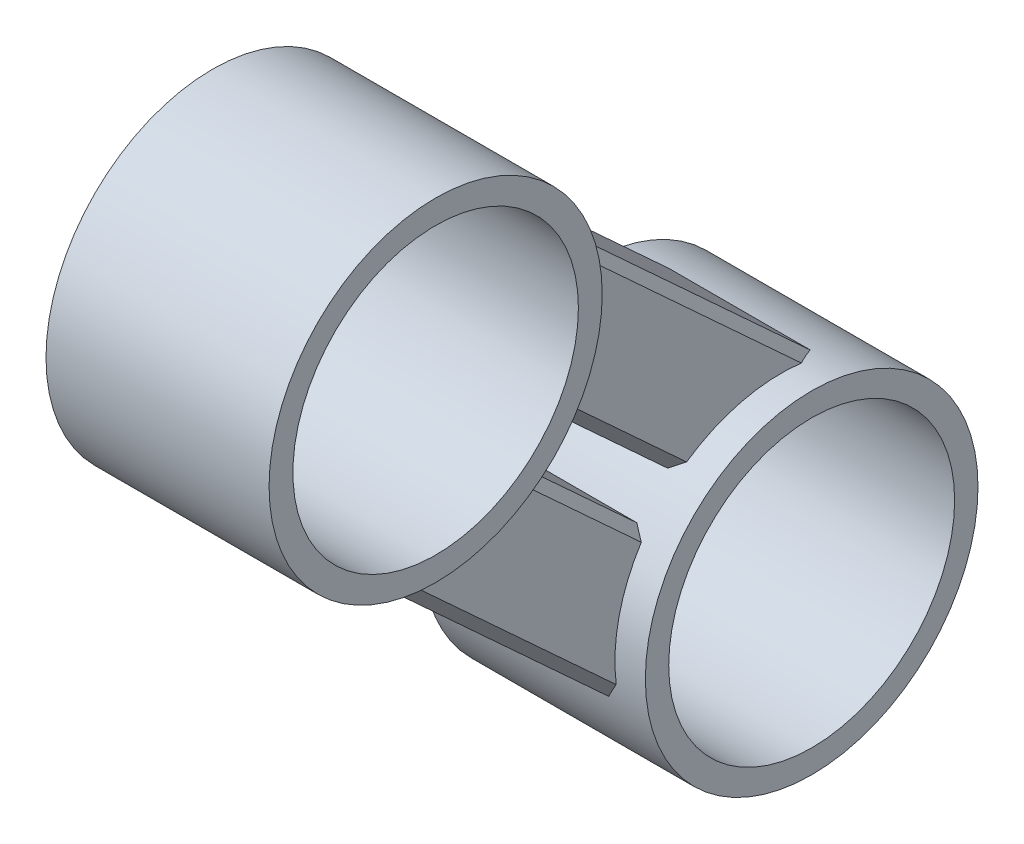
ISO-10303-21;
HEADER;
FILE_DESCRIPTION(('STEP AP214'),'2;1');
FILE_NAME('part.step','',(''),(''),'','','');
FILE_SCHEMA(('AUTOMOTIVE_DESIGN { 1 0 10303 214 1 1 1 1 }'));
ENDSEC;
DATA;
#1=APPLICATION_CONTEXT('core data for automotive mechanical design processes');
#2=APPLICATION_PROTOCOL_DEFINITION('international standard','automotive_design',2000,#1);
#3=PRODUCT_CONTEXT('',#1,'mechanical');
#4=PRODUCT('Part','Part','',(#3));
#5=PRODUCT_RELATED_PRODUCT_CATEGORY('part','',(#4));
#6=PRODUCT_DEFINITION_FORMATION('','',#4);
#7=PRODUCT_DEFINITION_CONTEXT('part definition',#1,'design');
#8=PRODUCT_DEFINITION('design','',#6,#7);
#9=PRODUCT_DEFINITION_SHAPE('','',#8);
#10=(LENGTH_UNIT() NAMED_UNIT(*) SI_UNIT(.MILLI.,.METRE.));
#11=(NAMED_UNIT(*) PLANE_ANGLE_UNIT() SI_UNIT($,.RADIAN.));
#12=(NAMED_UNIT(*) SI_UNIT($,.STERADIAN.) SOLID_ANGLE_UNIT());
#13=UNCERTAINTY_MEASURE_WITH_UNIT(LENGTH_MEASURE(1.E-05),#10,'distance_accuracy_value','');
#14=(GEOMETRIC_REPRESENTATION_CONTEXT(3) GLOBAL_UNCERTAINTY_ASSIGNED_CONTEXT((#13)) GLOBAL_UNIT_ASSIGNED_CONTEXT((#10,
#11,#12)) REPRESENTATION_CONTEXT('',''));
#15=CARTESIAN_POINT('',(0.,0.,0.));
#16=DIRECTION('',(0.,0.,1.));
#17=DIRECTION('',(1.,0.,0.));
#18=AXIS2_PLACEMENT_3D('',#15,#16,#17);
#19=CARTESIAN_POINT('',(-14.713204,0.,0.));
#20=DIRECTION('',(1.,0.,0.));
#21=DIRECTION('',(0.,0.,-1.));
#22=AXIS2_PLACEMENT_3D('',#19,#20,#21);
#23=PLANE('',#22);
#24=CARTESIAN_POINT('',(-14.713204,438.166256,-86.798404));
#25=DIRECTION('',(1.,0.,0.));
#26=DIRECTION('',(0.,0.,-1.));
#27=AXIS2_PLACEMENT_3D('',#24,#25,#26);
#28=CIRCLE('',#27,30.1777538629966);
#29=CARTESIAN_POINT('',(-14.713204,454.478959614716,-61.4095771465586));
#30=VERTEX_POINT('',#29);
#31=CARTESIAN_POINT('',(-14.713204,434.38874318098,-56.8580094615551));
#32=VERTEX_POINT('',#31);
#33=EDGE_CURVE('E164',#30,#32,#28,.T.);
#34=ORIENTED_EDGE('',*,*,#33,.T.);
#35=DIRECTION('',(0.,0.676780174351595,0.736185163939497));
#36=VECTOR('',#35,1.);
#37=CARTESIAN_POINT('',(-14.713204,263.753737203528,-242.470656832143));
#38=LINE('',#37,#36);
#39=CARTESIAN_POINT('',(-14.713204,472.481941944729,-15.4211458540503));
#40=VERTEX_POINT('',#39);
#41=EDGE_CURVE('E149',#32,#40,#38,.T.);
#42=ORIENTED_EDGE('',*,*,#41,.T.);
#43=CARTESIAN_POINT('',(-14.713204,502.541794,-18.569432));
#44=DIRECTION('',(1.,0.,0.));
#45=DIRECTION('',(0.,0.,-1.));
#46=AXIS2_PLACEMENT_3D('',#43,#44,#45);
#47=CIRCLE('',#46,30.2242685807545);
#48=CARTESIAN_POINT('',(-14.713204,477.844848812442,-35.9926151088452));
#49=VERTEX_POINT('',#48);
#50=EDGE_CURVE('E161',#40,#49,#47,.T.);
#51=ORIENTED_EDGE('',*,*,#50,.T.);
#52=DIRECTION('',(0.,-0.676778574479396,-0.736186634710001));
#53=VECTOR('',#52,1.);
#54=CARTESIAN_POINT('',(-14.713204,276.910729279913,-254.564861387267));
#55=LINE('',#54,#53);
#56=EDGE_CURVE('E166',#49,#30,#55,.T.);
#57=ORIENTED_EDGE('',*,*,#56,.T.);
#58=EDGE_LOOP('',(#34,#42,#51,#57));
#59=FACE_BOUND('',#58,.T.);
#60=ADVANCED_FACE('F33',(#59),#23,.F.);
#61=CARTESIAN_POINT('',(14.713204,0.,0.));
#62=DIRECTION('',(1.,0.,0.));
#63=DIRECTION('',(0.,0.,-1.));
#64=AXIS2_PLACEMENT_3D('',#61,#62,#63);
#65=PLANE('',#64);
#66=CARTESIAN_POINT('',(14.713204,502.541794,-18.569432));
#67=DIRECTION('',(1.,0.,0.));
#68=DIRECTION('',(0.,0.,-1.));
#69=AXIS2_PLACEMENT_3D('',#66,#67,#68);
#70=CIRCLE('',#69,30.2242685807545);
#71=CARTESIAN_POINT('',(14.713204,472.481941944729,-15.4211458540503));
#72=VERTEX_POINT('',#71);
#73=CARTESIAN_POINT('',(14.713204,477.844848812442,-35.9926151088453));
#74=VERTEX_POINT('',#73);
#75=EDGE_CURVE('E217',#72,#74,#70,.T.);
#76=ORIENTED_EDGE('',*,*,#75,.F.);
#77=DIRECTION('',(0.,-0.676780174351595,-0.736185163939497));
#78=VECTOR('',#77,1.);
#79=CARTESIAN_POINT('',(14.713204,432.702139805708,-58.6926559677333));
#80=LINE('',#79,#78);
#81=CARTESIAN_POINT('',(14.713204,434.38874318098,-56.8580094615551));
#82=VERTEX_POINT('',#81);
#83=EDGE_CURVE('E245',#72,#82,#80,.T.);
#84=ORIENTED_EDGE('',*,*,#83,.T.);
#85=CARTESIAN_POINT('',(14.713204,438.166256,-86.798404));
#86=DIRECTION('',(1.,0.,0.));
#87=DIRECTION('',(0.,0.,-1.));
#88=AXIS2_PLACEMENT_3D('',#85,#86,#87);
#89=CIRCLE('',#88,30.1777538629966);
#90=CARTESIAN_POINT('',(14.713204,454.478959614716,-61.4095771465587));
#91=VERTEX_POINT('',#90);
#92=EDGE_CURVE('E193',#91,#82,#89,.T.);
#93=ORIENTED_EDGE('',*,*,#92,.F.);
#94=DIRECTION('',(0.,0.676778574479396,0.736186634710001));
#95=VECTOR('',#94,1.);
#96=CARTESIAN_POINT('',(14.713204,477.609993653024,-36.248086005792));
#97=LINE('',#96,#95);
#98=EDGE_CURVE('E243',#91,#74,#97,.T.);
#99=ORIENTED_EDGE('',*,*,#98,.T.);
#100=EDGE_LOOP('',(#76,#84,#93,#99));
#101=FACE_BOUND('',#100,.T.);
#102=ADVANCED_FACE('F319',(#101),#65,.T.);
#103=CARTESIAN_POINT('',(-14.713204,438.166256,-86.798404));
#104=DIRECTION('',(1.,0.,0.));
#105=DIRECTION('',(0.,0.,-1.));
#106=AXIS2_PLACEMENT_3D('',#103,#104,#105);
#107=CYLINDRICAL_SURFACE('',#106,30.1777538629966);
#108=ORIENTED_EDGE('',*,*,#33,.F.);
#109=CARTESIAN_POINT('',(-9.53978433156355,438.166256,-86.798404));
#110=DIRECTION('',(0.707106781186558,-0.520562561622338,0.478554719376139));
#111=DIRECTION('',(0.707106781186537,0.520562561622353,-0.478554719376153));
#112=AXIS2_PLACEMENT_3D('',#109,#110,#111);
#113=ELLIPSE('',#112,42.6777887950062,30.1777538629966);
#114=CARTESIAN_POINT('',(-12.8186179999999,456.055171480117,-62.4944222035779));
#115=VERTEX_POINT('',#114);
#116=EDGE_CURVE('E251',#30,#115,#113,.F.);
#117=ORIENTED_EDGE('',*,*,#116,.T.);
#118=DIRECTION('',(1.,0.,0.));
#119=VECTOR('',#118,1.);
#120=CARTESIAN_POINT('',(-14.713204,456.055171480117,-62.4944222035779));
#121=LINE('',#120,#119);
#122=CARTESIAN_POINT('',(12.8186179999999,456.055171480117,-62.4944222035779));
#123=VERTEX_POINT('',#122);
#124=EDGE_CURVE('E207',#115,#123,#121,.T.);
#125=ORIENTED_EDGE('',*,*,#124,.T.);
#126=CARTESIAN_POINT('',(9.53978433156348,438.166256,-86.798404));
#127=DIRECTION('',(0.707106781186547,0.520562561622346,-0.478554719376146));
#128=DIRECTION('',(0.707106781186548,-0.520562561622345,0.478554719376145));
#129=AXIS2_PLACEMENT_3D('',#126,#127,#128);
#130=ELLIPSE('',#129,42.6777887950069,30.1777538629966);
#131=EDGE_CURVE('E266',#123,#91,#130,.T.);
#132=ORIENTED_EDGE('',*,*,#131,.T.);
#133=ORIENTED_EDGE('',*,*,#92,.T.);
#134=CARTESIAN_POINT('',(37.7572183298374,438.166256,-86.798404));
#135=DIRECTION('',(0.707106781186562,-0.520561521630538,0.478555850656617));
#136=DIRECTION('',(0.707106781186533,0.520561521630559,-0.478555850656637));
#137=AXIS2_PLACEMENT_3D('',#134,#135,#136);
#138=ELLIPSE('',#137,42.6777887950059,30.1777538629966);
#139=CARTESIAN_POINT('',(12.818618,431.307373700701,-57.4104377243292));
#140=VERTEX_POINT('',#139);
#141=EDGE_CURVE('E264',#82,#140,#138,.T.);
#142=ORIENTED_EDGE('',*,*,#141,.T.);
#143=DIRECTION('',(1.,0.,0.));
#144=VECTOR('',#143,1.);
#145=CARTESIAN_POINT('',(-14.713204,431.307373700701,-57.4104377243292));
#146=LINE('',#145,#144);
#147=CARTESIAN_POINT('',(-12.818618,431.307373700701,-57.4104377243292));
#148=VERTEX_POINT('',#147);
#149=EDGE_CURVE('E190',#148,#140,#146,.T.);
#150=ORIENTED_EDGE('',*,*,#149,.F.);
#151=CARTESIAN_POINT('',(-37.7572183298382,438.166256,-86.798404));
#152=DIRECTION('',(0.707106781186551,0.520561521630546,-0.478555850656625));
#153=DIRECTION('',(0.707106781186544,-0.520561521630551,0.478555850656629));
#154=AXIS2_PLACEMENT_3D('',#151,#152,#153);
#155=ELLIPSE('',#154,42.6777887950066,30.1777538629966);
#156=EDGE_CURVE('E155',#148,#32,#155,.F.);
#157=ORIENTED_EDGE('',*,*,#156,.T.);
#158=EDGE_LOOP('',(#108,#117,#125,#132,#133,#142,#150,#157));
#159=FACE_BOUND('',#158,.T.);
#160=CARTESIAN_POINT('',(-14.713204,468.122246091516,-90.450182450649));
#161=VERTEX_POINT('',#160);
#162=CARTESIAN_POINT('',(-14.713204,462.98587973345,-69.6320675840494));
#163=VERTEX_POINT('',#162);
#164=EDGE_CURVE('E186',#161,#163,#28,.T.);
#165=ORIENTED_EDGE('',*,*,#164,.F.);
#166=CARTESIAN_POINT('',(-39.2378523036519,438.166256,-86.798404));
#167=DIRECTION('',(0.70710678118654,-0.520562652913584,0.478554620071296));
#168=DIRECTION('',(0.707106781186555,0.520562652913572,-0.478554620071286));
#169=AXIS2_PLACEMENT_3D('',#166,#167,#168);
#170=ELLIPSE('',#169,42.6777887950073,30.1777538629966);
#171=CARTESIAN_POINT('',(-12.818618,467.48652902231,-93.9411218379652));
#172=VERTEX_POINT('',#171);
#173=EDGE_CURVE('E258',#161,#172,#170,.F.);
#174=ORIENTED_EDGE('',*,*,#173,.T.);
#175=DIRECTION('',(1.,0.,0.));
#176=VECTOR('',#175,1.);
#177=CARTESIAN_POINT('',(-14.713204,467.48652902231,-93.9411218379652));
#178=LINE('',#177,#176);
#179=CARTESIAN_POINT('',(12.818618,467.48652902231,-93.9411218379652));
#180=VERTEX_POINT('',#179);
#181=EDGE_CURVE('E199',#172,#180,#178,.T.);
#182=ORIENTED_EDGE('',*,*,#181,.T.);
#183=CARTESIAN_POINT('',(39.2378523036523,438.166256,-86.798404));
#184=DIRECTION('',(0.707106781186535,0.520562652913587,-0.4785546200713));
#185=DIRECTION('',(0.70710678118656,-0.520562652913569,0.478554620071282));
#186=AXIS2_PLACEMENT_3D('',#183,#184,#185);
#187=ELLIPSE('',#186,42.6777887950076,30.1777538629966);
#188=CARTESIAN_POINT('',(14.713204,468.122246091516,-90.450182450649));
#189=VERTEX_POINT('',#188);
#190=EDGE_CURVE('E41',#180,#189,#187,.T.);
#191=ORIENTED_EDGE('',*,*,#190,.T.);
#192=CARTESIAN_POINT('',(14.713204,462.98587973345,-69.6320675840496));
#193=VERTEX_POINT('',#192);
#194=EDGE_CURVE('E212',#189,#193,#89,.T.);
#195=ORIENTED_EDGE('',*,*,#194,.T.);
#196=CARTESIAN_POINT('',(8.05913180236798,438.166256,-86.798404));
#197=DIRECTION('',(0.707106781186531,-0.52056265291359,0.478554620071302));
#198=DIRECTION('',(0.707106781186564,0.520562652913566,-0.47855462007128));
#199=AXIS2_PLACEMENT_3D('',#196,#197,#198);
#200=ELLIPSE('',#199,42.6777887950078,30.1777538629966);
#201=CARTESIAN_POINT('',(12.8186179999999,461.838170852263,-68.0811051713006));
#202=VERTEX_POINT('',#201);
#203=EDGE_CURVE('E272',#193,#202,#200,.T.);
#204=ORIENTED_EDGE('',*,*,#203,.T.);
#205=DIRECTION('',(1.,0.,0.));
#206=VECTOR('',#205,1.);
#207=CARTESIAN_POINT('',(-14.713204,461.838170852263,-68.0811051713006));
#208=LINE('',#207,#206);
#209=CARTESIAN_POINT('',(-12.818618,461.838170852263,-68.0811051713006));
#210=VERTEX_POINT('',#209);
#211=EDGE_CURVE('E189',#210,#202,#208,.T.);
#212=ORIENTED_EDGE('',*,*,#211,.F.);
#213=CARTESIAN_POINT('',(-8.05913180236799,438.166256,-86.798404));
#214=DIRECTION('',(0.707106781186523,0.520562652913596,-0.478554620071308));
#215=DIRECTION('',(0.707106781186572,-0.52056265291356,0.478554620071274));
#216=AXIS2_PLACEMENT_3D('',#213,#214,#215);
#217=ELLIPSE('',#216,42.6777887950083,30.1777538629966);
#218=EDGE_CURVE('E256',#210,#163,#217,.F.);
#219=ORIENTED_EDGE('',*,*,#218,.T.);
#220=EDGE_LOOP('',(#165,#174,#182,#191,#195,#204,#212,#219));
#221=FACE_BOUND('',#220,.T.);
#222=CARTESIAN_POINT('',(20.236561,438.166256,-86.798404));
#223=DIRECTION('',(1.,0.,0.));
#224=DIRECTION('',(0.,0.,-1.));
#225=AXIS2_PLACEMENT_3D('',#222,#223,#224);
#226=CIRCLE('',#225,30.1777538629966);
#227=CARTESIAN_POINT('',(20.236561,438.166256,-116.976157862997));
#228=VERTEX_POINT('',#227);
#229=EDGE_CURVE('E173',#228,#228,#226,.T.);
#230=ORIENTED_EDGE('',*,*,#229,.F.);
#231=EDGE_LOOP('',(#230));
#232=FACE_BOUND('',#231,.T.);
#233=CARTESIAN_POINT('',(-20.236561,438.166256,-86.798404));
#234=DIRECTION('',(1.,0.,0.));
#235=DIRECTION('',(0.,0.,-1.));
#236=AXIS2_PLACEMENT_3D('',#233,#234,#235);
#237=CIRCLE('',#236,30.1777538629966);
#238=CARTESIAN_POINT('',(-20.236561,438.166256,-116.976157862997));
#239=VERTEX_POINT('',#238);
#240=EDGE_CURVE('E177',#239,#239,#237,.T.);
#241=ORIENTED_EDGE('',*,*,#240,.T.);
#242=EDGE_LOOP('',(#241));
#243=FACE_BOUND('',#242,.T.);
#244=ADVANCED_FACE('F276',(#159,#221,#232,#243),#107,.T.);
#245=CARTESIAN_POINT('',(-14.713204,262.35897109852,-241.188438588738));
#246=DIRECTION('',(0.,0.736185163939497,-0.676780174351595));
#247=DIRECTION('',(0.,0.676780174351595,0.736185163939497));
#248=AXIS2_PLACEMENT_3D('',#245,#246,#247);
#249=PLANE('',#248);
#250=DIRECTION('',(1.,0.,0.));
#251=VECTOR('',#250,1.);
#252=CARTESIAN_POINT('',(-14.713204,473.03584486157,-12.0192124096386));
#253=LINE('',#252,#251);
#254=CARTESIAN_POINT('',(-12.818618,473.03584486157,-12.0192124096386));
#255=VERTEX_POINT('',#254);
#256=CARTESIAN_POINT('',(12.818618,473.03584486157,-12.0192124096386));
#257=VERTEX_POINT('',#256);
#258=EDGE_CURVE('E194',#255,#257,#253,.T.);
#259=ORIENTED_EDGE('',*,*,#258,.F.);
#260=DIRECTION('',(0.,-0.676780174351595,-0.736185163939497));
#261=VECTOR('',#260,1.);
#262=CARTESIAN_POINT('',(-12.818618,262.35897109852,-241.188438588738));
#263=LINE('',#262,#261);
#264=EDGE_CURVE('E150',#255,#148,#263,.T.);
#265=ORIENTED_EDGE('',*,*,#264,.T.);
#266=ORIENTED_EDGE('',*,*,#149,.T.);
#267=DIRECTION('',(0.,0.676780174351595,0.736185163939497));
#268=VECTOR('',#267,1.);
#269=CARTESIAN_POINT('',(12.818618,473.03584486157,-12.0192124096387));
#270=LINE('',#269,#268);
#271=EDGE_CURVE('E165',#140,#257,#270,.T.);
#272=ORIENTED_EDGE('',*,*,#271,.T.);
#273=EDGE_LOOP('',(#259,#265,#266,#272));
#274=FACE_BOUND('',#273,.T.);
#275=ADVANCED_FACE('F344',(#274),#249,.F.);
#276=CARTESIAN_POINT('',(-14.713204,502.541794,-18.569432));
#277=DIRECTION('',(1.,0.,0.));
#278=DIRECTION('',(0.,0.,-1.));
#279=AXIS2_PLACEMENT_3D('',#276,#277,#278);
#280=CYLINDRICAL_SURFACE('',#279,30.2242685807545);
#281=ORIENTED_EDGE('',*,*,#50,.F.);
#282=CARTESIAN_POINT('',(-38.9735187600714,502.541794,-18.569432));
#283=DIRECTION('',(0.707106781186551,0.520561521630546,-0.478555850656625));
#284=DIRECTION('',(0.707106781186544,-0.520561521630551,0.478555850656629));
#285=AXIS2_PLACEMENT_3D('',#282,#283,#284);
#286=ELLIPSE('',#285,42.7435705397099,30.2242685807545);
#287=EDGE_CURVE('E145',#40,#255,#286,.F.);
#288=ORIENTED_EDGE('',*,*,#287,.T.);
#289=ORIENTED_EDGE('',*,*,#258,.T.);
#290=CARTESIAN_POINT('',(38.9735187600706,502.541794,-18.569432));
#291=DIRECTION('',(0.707106781186562,-0.520561521630538,0.478555850656617));
#292=DIRECTION('',(0.707106781186533,0.520561521630559,-0.478555850656637));
#293=AXIS2_PLACEMENT_3D('',#290,#291,#292);
#294=ELLIPSE('',#293,42.7435705397092,30.2242685807545);
#295=EDGE_CURVE('E262',#257,#72,#294,.T.);
#296=ORIENTED_EDGE('',*,*,#295,.T.);
#297=ORIENTED_EDGE('',*,*,#75,.T.);
#298=CARTESIAN_POINT('',(8.32328006205227,502.541794,-18.569432));
#299=DIRECTION('',(0.707106781186547,0.520562561622346,-0.478554719376146));
#300=DIRECTION('',(0.707106781186548,-0.520562561622345,0.478554719376145));
#301=AXIS2_PLACEMENT_3D('',#298,#299,#300);
#302=ELLIPSE('',#301,42.7435705397101,30.2242685807545);
#303=CARTESIAN_POINT('',(12.8186179999999,479.004762544532,-37.5303012181006));
#304=VERTEX_POINT('',#303);
#305=EDGE_CURVE('E268',#74,#304,#302,.T.);
#306=ORIENTED_EDGE('',*,*,#305,.T.);
#307=DIRECTION('',(1.,0.,0.));
#308=VECTOR('',#307,1.);
#309=CARTESIAN_POINT('',(-14.713204,479.004762544532,-37.5303012181006));
#310=LINE('',#309,#308);
#311=CARTESIAN_POINT('',(-12.8186179999999,479.004762544532,-37.5303012181006));
#312=VERTEX_POINT('',#311);
#313=EDGE_CURVE('E204',#312,#304,#310,.T.);
#314=ORIENTED_EDGE('',*,*,#313,.F.);
#315=CARTESIAN_POINT('',(-8.3232800620524,502.541794,-18.569432));
#316=DIRECTION('',(0.707106781186558,-0.520562561622338,0.478554719376139));
#317=DIRECTION('',(0.707106781186537,0.520562561622353,-0.478554719376153));
#318=AXIS2_PLACEMENT_3D('',#315,#316,#317);
#319=ELLIPSE('',#318,42.7435705397094,30.2242685807545);
#320=EDGE_CURVE('E172',#312,#49,#319,.F.);
#321=ORIENTED_EDGE('',*,*,#320,.T.);
#322=EDGE_LOOP('',(#281,#288,#289,#296,#297,#306,#314,#321));
#323=FACE_BOUND('',#322,.T.);
#324=DIRECTION('',(1.,0.,0.));
#325=VECTOR('',#324,1.);
#326=CARTESIAN_POINT('',(-14.713204,509.804855969095,-47.9080472037664));
#327=LINE('',#326,#325);
#328=CARTESIAN_POINT('',(-12.818618,509.804855969095,-47.9080472037664));
#329=VERTEX_POINT('',#328);
#330=CARTESIAN_POINT('',(12.818618,509.804855969095,-47.9080472037664));
#331=VERTEX_POINT('',#330);
#332=EDGE_CURVE('E196',#329,#331,#327,.T.);
#333=ORIENTED_EDGE('',*,*,#332,.F.);
#334=CARTESIAN_POINT('',(-38.0213301409587,502.541794,-18.569432));
#335=DIRECTION('',(0.70710678118654,-0.520562652913584,0.478554620071296));
#336=DIRECTION('',(0.707106781186555,0.520562652913572,-0.478554620071286));
#337=AXIS2_PLACEMENT_3D('',#334,#335,#336);
#338=ELLIPSE('',#337,42.7435705397105,30.2242685807545);
#339=CARTESIAN_POINT('',(-14.713204,506.67865447932,-48.5092515822258));
#340=VERTEX_POINT('',#339);
#341=EDGE_CURVE('E260',#329,#340,#338,.F.);
#342=ORIENTED_EDGE('',*,*,#341,.T.);
#343=CARTESIAN_POINT('',(-14.713204,486.423465932549,-44.1371051743742));
#344=VERTEX_POINT('',#343);
#345=EDGE_CURVE('E174',#344,#340,#47,.T.);
#346=ORIENTED_EDGE('',*,*,#345,.F.);
#347=CARTESIAN_POINT('',(-9.27565396506137,502.541794,-18.569432));
#348=DIRECTION('',(0.707106781186523,0.520562652913596,-0.478554620071308));
#349=DIRECTION('',(0.707106781186572,-0.52056265291356,0.478554620071274));
#350=AXIS2_PLACEMENT_3D('',#347,#348,#349);
#351=ELLIPSE('',#350,42.7435705397116,30.2242685807545);
#352=CARTESIAN_POINT('',(-12.818618,484.835968341037,-43.0645365920607));
#353=VERTEX_POINT('',#352);
#354=EDGE_CURVE('E254',#344,#353,#351,.F.);
#355=ORIENTED_EDGE('',*,*,#354,.T.);
#356=DIRECTION('',(1.,0.,0.));
#357=VECTOR('',#356,1.);
#358=CARTESIAN_POINT('',(-14.713204,484.835968341037,-43.0645365920607));
#359=LINE('',#358,#357);
#360=CARTESIAN_POINT('',(12.8186179999999,484.835968341037,-43.0645365920607));
#361=VERTEX_POINT('',#360);
#362=EDGE_CURVE('E201',#353,#361,#359,.T.);
#363=ORIENTED_EDGE('',*,*,#362,.T.);
#364=CARTESIAN_POINT('',(9.27565396506132,502.541794,-18.569432));
#365=DIRECTION('',(0.707106781186531,-0.52056265291359,0.478554620071302));
#366=DIRECTION('',(0.707106781186564,0.520562652913566,-0.47855462007128));
#367=AXIS2_PLACEMENT_3D('',#364,#365,#366);
#368=ELLIPSE('',#367,42.7435705397111,30.2242685807545);
#369=CARTESIAN_POINT('',(14.713204,486.423465932549,-44.1371051743743));
#370=VERTEX_POINT('',#369);
#371=EDGE_CURVE('E270',#361,#370,#368,.T.);
#372=ORIENTED_EDGE('',*,*,#371,.T.);
#373=CARTESIAN_POINT('',(14.713204,506.67865447932,-48.5092515822258));
#374=VERTEX_POINT('',#373);
#375=EDGE_CURVE('E214',#370,#374,#70,.T.);
#376=ORIENTED_EDGE('',*,*,#375,.T.);
#377=CARTESIAN_POINT('',(38.021330140959,502.541794,-18.569432));
#378=DIRECTION('',(0.707106781186535,0.520562652913587,-0.4785546200713));
#379=DIRECTION('',(0.70710678118656,-0.520562652913569,0.478554620071282));
#380=AXIS2_PLACEMENT_3D('',#377,#378,#379);
#381=ELLIPSE('',#380,42.7435705397109,30.2242685807545);
#382=EDGE_CURVE('E11',#374,#331,#381,.T.);
#383=ORIENTED_EDGE('',*,*,#382,.T.);
#384=EDGE_LOOP('',(#333,#342,#346,#355,#363,#372,#376,#383));
#385=FACE_BOUND('',#384,.T.);
#386=CARTESIAN_POINT('',(20.236561,502.541794,-18.569432));
#387=DIRECTION('',(1.,0.,0.));
#388=DIRECTION('',(0.,0.,-1.));
#389=AXIS2_PLACEMENT_3D('',#386,#387,#388);
#390=CIRCLE('',#389,30.2242685807545);
#391=CARTESIAN_POINT('',(20.236561,502.541794,-48.7937005807545));
#392=VERTEX_POINT('',#391);
#393=EDGE_CURVE('E395',#392,#392,#390,.T.);
#394=ORIENTED_EDGE('',*,*,#393,.F.);
#395=EDGE_LOOP('',(#394));
#396=FACE_BOUND('',#395,.T.);
#397=CARTESIAN_POINT('',(-20.236561,502.541794,-18.569432));
#398=DIRECTION('',(1.,0.,0.));
#399=DIRECTION('',(0.,0.,-1.));
#400=AXIS2_PLACEMENT_3D('',#397,#398,#399);
#401=CIRCLE('',#400,30.2242685807545);
#402=CARTESIAN_POINT('',(-20.236561,502.541794,-48.7937005807545));
#403=VERTEX_POINT('',#402);
#404=EDGE_CURVE('E180',#403,#403,#401,.T.);
#405=ORIENTED_EDGE('',*,*,#404,.T.);
#406=EDGE_LOOP('',(#405));
#407=FACE_BOUND('',#406,.T.);
#408=ADVANCED_FACE('F168',(#323,#385,#396,#407),#280,.T.);
#409=CARTESIAN_POINT('',(-14.713204,284.223284338462,-261.287215075316));
#410=DIRECTION('',(0.,0.7361867638153,-0.676778434041123));
#411=DIRECTION('',(0.,0.676778434041123,0.7361867638153));
#412=AXIS2_PLACEMENT_3D('',#409,#410,#411);
#413=PLANE('',#412);
#414=ORIENTED_EDGE('',*,*,#362,.F.);
#415=DIRECTION('',(0.,-0.676778434041123,-0.7361867638153));
#416=VECTOR('',#415,1.);
#417=CARTESIAN_POINT('',(-12.818618,284.223284338462,-261.287215075316));
#418=LINE('',#417,#416);
#419=EDGE_CURVE('E236',#353,#210,#418,.T.);
#420=ORIENTED_EDGE('',*,*,#419,.T.);
#421=ORIENTED_EDGE('',*,*,#211,.T.);
#422=DIRECTION('',(0.,0.676778434041123,0.7361867638153));
#423=VECTOR('',#422,1.);
#424=CARTESIAN_POINT('',(12.8186179999999,484.835968341037,-43.0645365920607));
#425=LINE('',#424,#423);
#426=EDGE_CURVE('E233',#202,#361,#425,.T.);
#427=ORIENTED_EDGE('',*,*,#426,.T.);
#428=EDGE_LOOP('',(#414,#420,#421,#427));
#429=FACE_BOUND('',#428,.T.);
#430=ADVANCED_FACE('F283',(#429),#413,.F.);
#431=CARTESIAN_POINT('',(-14.713204,278.305498171422,-255.847076599575));
#432=DIRECTION('',(0.,-0.736186634710001,0.676778574479396));
#433=DIRECTION('',(0.,-0.676778574479396,-0.736186634710001));
#434=AXIS2_PLACEMENT_3D('',#431,#432,#433);
#435=PLANE('',#434);
#436=ORIENTED_EDGE('',*,*,#124,.F.);
#437=DIRECTION('',(0.,0.676778574479396,0.736186634710001));
#438=VECTOR('',#437,1.);
#439=CARTESIAN_POINT('',(-12.8186179999999,278.305498171422,-255.847076599575));
#440=LINE('',#439,#438);
#441=EDGE_CURVE('E225',#115,#312,#440,.T.);
#442=ORIENTED_EDGE('',*,*,#441,.T.);
#443=ORIENTED_EDGE('',*,*,#313,.T.);
#444=DIRECTION('',(0.,-0.676778574479396,-0.736186634710001));
#445=VECTOR('',#444,1.);
#446=CARTESIAN_POINT('',(12.8186179999999,456.055171480117,-62.4944222035778));
#447=LINE('',#446,#445);
#448=EDGE_CURVE('E222',#304,#123,#447,.T.);
#449=ORIENTED_EDGE('',*,*,#448,.T.);
#450=EDGE_LOOP('',(#436,#442,#443,#449));
#451=FACE_BOUND('',#450,.T.);
#452=ADVANCED_FACE('F334',(#451),#435,.F.);
#453=CARTESIAN_POINT('',(-14.713204,300.168904201687,-275.946065480233));
#454=DIRECTION('',(0.,-0.7361867638153,0.676778434041123));
#455=DIRECTION('',(0.,-0.676778434041124,-0.7361867638153));
#456=AXIS2_PLACEMENT_3D('',#453,#454,#455);
#457=PLANE('',#456);
#458=ORIENTED_EDGE('',*,*,#181,.F.);
#459=DIRECTION('',(0.,0.676778434041124,0.7361867638153));
#460=VECTOR('',#459,1.);
#461=CARTESIAN_POINT('',(-12.818618,300.168904201687,-275.946065480233));
#462=LINE('',#461,#460);
#463=EDGE_CURVE('E241',#172,#329,#462,.T.);
#464=ORIENTED_EDGE('',*,*,#463,.T.);
#465=ORIENTED_EDGE('',*,*,#332,.T.);
#466=DIRECTION('',(0.,-0.676778434041124,-0.7361867638153));
#467=VECTOR('',#466,1.);
#468=CARTESIAN_POINT('',(12.818618,467.48652902231,-93.9411218379652));
#469=LINE('',#468,#467);
#470=EDGE_CURVE('E238',#331,#180,#469,.T.);
#471=ORIENTED_EDGE('',*,*,#470,.T.);
#472=EDGE_LOOP('',(#458,#464,#465,#471));
#473=FACE_BOUND('',#472,.T.);
#474=ADVANCED_FACE('F296',(#473),#457,.F.);
#475=ORIENTED_EDGE('',*,*,#164,.T.);
#476=DIRECTION('',(0.,0.676778434041123,0.7361867638153));
#477=VECTOR('',#476,1.);
#478=CARTESIAN_POINT('',(-14.713204,285.618053474572,-262.569430021552));
#479=LINE('',#478,#477);
#480=EDGE_CURVE('E230',#163,#344,#479,.T.);
#481=ORIENTED_EDGE('',*,*,#480,.T.);
#482=ORIENTED_EDGE('',*,*,#345,.T.);
#483=DIRECTION('',(0.,-0.676778434041124,-0.7361867638153));
#484=VECTOR('',#483,1.);
#485=CARTESIAN_POINT('',(-14.713204,298.774135065577,-274.663850533997));
#486=LINE('',#485,#484);
#487=EDGE_CURVE('E227',#340,#161,#486,.T.);
#488=ORIENTED_EDGE('',*,*,#487,.T.);
#489=EDGE_LOOP('',(#475,#481,#482,#488));
#490=FACE_BOUND('',#489,.T.);
#491=ADVANCED_FACE('F303',(#490),#23,.F.);
#492=ORIENTED_EDGE('',*,*,#375,.F.);
#493=DIRECTION('',(0.,-0.676778434041123,-0.7361867638153));
#494=VECTOR('',#493,1.);
#495=CARTESIAN_POINT('',(14.713204,463.232939988372,-69.3633201175369));
#496=LINE('',#495,#494);
#497=EDGE_CURVE('E48',#370,#193,#496,.T.);
#498=ORIENTED_EDGE('',*,*,#497,.T.);
#499=ORIENTED_EDGE('',*,*,#194,.F.);
#500=DIRECTION('',(0.,0.676778434041124,0.7361867638153));
#501=VECTOR('',#500,1.);
#502=CARTESIAN_POINT('',(14.713204,508.410086832985,-46.6258322575301));
#503=LINE('',#502,#501);
#504=EDGE_CURVE('E247',#189,#374,#503,.T.);
#505=ORIENTED_EDGE('',*,*,#504,.T.);
#506=EDGE_LOOP('',(#492,#498,#499,#505));
#507=FACE_BOUND('',#506,.T.);
#508=ADVANCED_FACE('F289',(#507),#65,.T.);
#509=CARTESIAN_POINT('',(20.236561,0.,0.));
#510=DIRECTION('',(1.,0.,0.));
#511=DIRECTION('',(0.,0.,-1.));
#512=AXIS2_PLACEMENT_3D('',#509,#510,#511);
#513=PLANE('',#512);
#514=CARTESIAN_POINT('',(20.236561,438.166256,-86.798404));
#515=DIRECTION('',(1.,0.,0.));
#516=DIRECTION('',(0.,0.,-1.));
#517=AXIS2_PLACEMENT_3D('',#514,#515,#516);
#518=CIRCLE('',#517,25.9393296685651);
#519=CARTESIAN_POINT('',(20.236561,438.166256,-112.737733668565));
#520=VERTEX_POINT('',#519);
#521=EDGE_CURVE('E386',#520,#520,#518,.T.);
#522=ORIENTED_EDGE('',*,*,#521,.F.);
#523=EDGE_LOOP('',(#522));
#524=FACE_BOUND('',#523,.T.);
#525=ORIENTED_EDGE('',*,*,#229,.T.);
#526=EDGE_LOOP('',(#525));
#527=FACE_BOUND('',#526,.T.);
#528=ADVANCED_FACE('F333',(#524,#527),#513,.T.);
#529=CARTESIAN_POINT('',(-20.236561,0.,0.));
#530=DIRECTION('',(1.,0.,0.));
#531=DIRECTION('',(0.,0.,-1.));
#532=AXIS2_PLACEMENT_3D('',#529,#530,#531);
#533=PLANE('',#532);
#534=CARTESIAN_POINT('',(-20.236561,438.166256,-86.798404));
#535=DIRECTION('',(1.,0.,0.));
#536=DIRECTION('',(0.,0.,-1.));
#537=AXIS2_PLACEMENT_3D('',#534,#535,#536);
#538=CIRCLE('',#537,25.9393296685651);
#539=CARTESIAN_POINT('',(-20.236561,438.166256,-112.737733668565));
#540=VERTEX_POINT('',#539);
#541=EDGE_CURVE('E382',#540,#540,#538,.T.);
#542=ORIENTED_EDGE('',*,*,#541,.T.);
#543=EDGE_LOOP('',(#542));
#544=FACE_BOUND('',#543,.T.);
#545=ORIENTED_EDGE('',*,*,#240,.F.);
#546=EDGE_LOOP('',(#545));
#547=FACE_BOUND('',#546,.T.);
#548=ADVANCED_FACE('F368',(#544,#547),#533,.F.);
#549=CARTESIAN_POINT('',(20.236561,0.,0.));
#550=DIRECTION('',(1.,0.,0.));
#551=DIRECTION('',(0.,0.,-1.));
#552=AXIS2_PLACEMENT_3D('',#549,#550,#551);
#553=PLANE('',#552);
#554=CARTESIAN_POINT('',(20.236561,502.541794,-18.569432));
#555=DIRECTION('',(1.,0.,0.));
#556=DIRECTION('',(0.,0.,-1.));
#557=AXIS2_PLACEMENT_3D('',#554,#555,#556);
#558=CIRCLE('',#557,25.902158);
#559=CARTESIAN_POINT('',(20.236561,502.541794,-44.47159));
#560=VERTEX_POINT('',#559);
#561=EDGE_CURVE('E385',#560,#560,#558,.T.);
#562=ORIENTED_EDGE('',*,*,#561,.F.);
#563=EDGE_LOOP('',(#562));
#564=FACE_BOUND('',#563,.T.);
#565=ORIENTED_EDGE('',*,*,#393,.T.);
#566=EDGE_LOOP('',(#565));
#567=FACE_BOUND('',#566,.T.);
#568=ADVANCED_FACE('F365',(#564,#567),#553,.T.);
#569=CARTESIAN_POINT('',(-20.236561,0.,0.));
#570=DIRECTION('',(1.,0.,0.));
#571=DIRECTION('',(0.,0.,-1.));
#572=AXIS2_PLACEMENT_3D('',#569,#570,#571);
#573=PLANE('',#572);
#574=CARTESIAN_POINT('',(-20.236561,502.541794,-18.569432));
#575=DIRECTION('',(1.,0.,0.));
#576=DIRECTION('',(0.,0.,-1.));
#577=AXIS2_PLACEMENT_3D('',#574,#575,#576);
#578=CIRCLE('',#577,25.902158);
#579=CARTESIAN_POINT('',(-20.236561,502.541794,-44.47159));
#580=VERTEX_POINT('',#579);
#581=EDGE_CURVE('E389',#580,#580,#578,.T.);
#582=ORIENTED_EDGE('',*,*,#581,.T.);
#583=EDGE_LOOP('',(#582));
#584=FACE_BOUND('',#583,.T.);
#585=ORIENTED_EDGE('',*,*,#404,.F.);
#586=EDGE_LOOP('',(#585));
#587=FACE_BOUND('',#586,.T.);
#588=ADVANCED_FACE('F359',(#584,#587),#573,.F.);
#589=CARTESIAN_POINT('',(-20.236561,502.541794,-18.569432));
#590=DIRECTION('',(1.,0.,0.));
#591=DIRECTION('',(0.,0.,-1.));
#592=AXIS2_PLACEMENT_3D('',#589,#590,#591);
#593=CYLINDRICAL_SURFACE('',#592,25.902158);
#594=ORIENTED_EDGE('',*,*,#581,.F.);
#595=EDGE_LOOP('',(#594));
#596=FACE_BOUND('',#595,.T.);
#597=ORIENTED_EDGE('',*,*,#561,.T.);
#598=EDGE_LOOP('',(#597));
#599=FACE_BOUND('',#598,.T.);
#600=ADVANCED_FACE('F354',(#596,#599),#593,.F.);
#601=CARTESIAN_POINT('',(-20.236561,438.166256,-86.798404));
#602=DIRECTION('',(1.,0.,0.));
#603=DIRECTION('',(0.,0.,-1.));
#604=AXIS2_PLACEMENT_3D('',#601,#602,#603);
#605=CYLINDRICAL_SURFACE('',#604,25.9393296685651);
#606=ORIENTED_EDGE('',*,*,#541,.F.);
#607=EDGE_LOOP('',(#606));
#608=FACE_BOUND('',#607,.T.);
#609=ORIENTED_EDGE('',*,*,#521,.T.);
#610=EDGE_LOOP('',(#609));
#611=FACE_BOUND('',#610,.T.);
#612=ADVANCED_FACE('F350',(#608,#611),#605,.F.);
#613=CARTESIAN_POINT('',(-14.713204,263.753737203528,-242.470656832143));
#614=DIRECTION('',(0.707106781186551,0.520561521630546,-0.478555850656625));
#615=DIRECTION('',(0.,0.676780174351595,0.736185163939497));
#616=AXIS2_PLACEMENT_3D('',#613,#614,#615);
#617=PLANE('',#616);
#618=ORIENTED_EDGE('',*,*,#156,.F.);
#619=ORIENTED_EDGE('',*,*,#264,.F.);
#620=ORIENTED_EDGE('',*,*,#287,.F.);
#621=ORIENTED_EDGE('',*,*,#41,.F.);
#622=EDGE_LOOP('',(#618,#619,#620,#621));
#623=FACE_BOUND('',#622,.T.);
#624=ADVANCED_FACE('F148',(#623),#617,.F.);
#625=CARTESIAN_POINT('',(-14.713204,276.910729279913,-254.564861387267));
#626=DIRECTION('',(0.707106781186558,-0.520562561622338,0.478554719376139));
#627=DIRECTION('',(0.,-0.676778574479396,-0.736186634710001));
#628=AXIS2_PLACEMENT_3D('',#625,#626,#627);
#629=PLANE('',#628);
#630=ORIENTED_EDGE('',*,*,#320,.F.);
#631=ORIENTED_EDGE('',*,*,#441,.F.);
#632=ORIENTED_EDGE('',*,*,#116,.F.);
#633=ORIENTED_EDGE('',*,*,#56,.F.);
#634=EDGE_LOOP('',(#630,#631,#632,#633));
#635=FACE_BOUND('',#634,.T.);
#636=ADVANCED_FACE('F308',(#635),#629,.F.);
#637=CARTESIAN_POINT('',(-14.713204,285.618053474572,-262.569430021552));
#638=DIRECTION('',(0.707106781186523,0.520562652913596,-0.478554620071308));
#639=DIRECTION('',(0.,0.676778434041123,0.7361867638153));
#640=AXIS2_PLACEMENT_3D('',#637,#638,#639);
#641=PLANE('',#640);
#642=ORIENTED_EDGE('',*,*,#218,.F.);
#643=ORIENTED_EDGE('',*,*,#419,.F.);
#644=ORIENTED_EDGE('',*,*,#354,.F.);
#645=ORIENTED_EDGE('',*,*,#480,.F.);
#646=EDGE_LOOP('',(#642,#643,#644,#645));
#647=FACE_BOUND('',#646,.T.);
#648=ADVANCED_FACE('F306',(#647),#641,.F.);
#649=CARTESIAN_POINT('',(-14.713204,298.774135065577,-274.663850533997));
#650=DIRECTION('',(0.70710678118654,-0.520562652913584,0.478554620071296));
#651=DIRECTION('',(0.,-0.676778434041124,-0.7361867638153));
#652=AXIS2_PLACEMENT_3D('',#649,#650,#651);
#653=PLANE('',#652);
#654=ORIENTED_EDGE('',*,*,#341,.F.);
#655=ORIENTED_EDGE('',*,*,#463,.F.);
#656=ORIENTED_EDGE('',*,*,#173,.F.);
#657=ORIENTED_EDGE('',*,*,#487,.F.);
#658=EDGE_LOOP('',(#654,#655,#656,#657));
#659=FACE_BOUND('',#658,.T.);
#660=ADVANCED_FACE('F299',(#659),#653,.F.);
#661=CARTESIAN_POINT('',(12.818618,262.35897109852,-241.188438588738));
#662=DIRECTION('',(0.707106781186562,-0.520561521630538,0.478555850656617));
#663=DIRECTION('',(0.,-0.676780174351595,-0.736185163939497));
#664=AXIS2_PLACEMENT_3D('',#661,#662,#663);
#665=PLANE('',#664);
#666=ORIENTED_EDGE('',*,*,#141,.F.);
#667=ORIENTED_EDGE('',*,*,#83,.F.);
#668=ORIENTED_EDGE('',*,*,#295,.F.);
#669=ORIENTED_EDGE('',*,*,#271,.F.);
#670=EDGE_LOOP('',(#666,#667,#668,#669));
#671=FACE_BOUND('',#670,.T.);
#672=ADVANCED_FACE('F314',(#671),#665,.T.);
#673=CARTESIAN_POINT('',(12.818618,278.305498171422,-255.847076599575));
#674=DIRECTION('',(0.707106781186547,0.520562561622346,-0.478554719376146));
#675=DIRECTION('',(0.,0.676778574479396,0.736186634710001));
#676=AXIS2_PLACEMENT_3D('',#673,#674,#675);
#677=PLANE('',#676);
#678=ORIENTED_EDGE('',*,*,#305,.F.);
#679=ORIENTED_EDGE('',*,*,#98,.F.);
#680=ORIENTED_EDGE('',*,*,#131,.F.);
#681=ORIENTED_EDGE('',*,*,#448,.F.);
#682=EDGE_LOOP('',(#678,#679,#680,#681));
#683=FACE_BOUND('',#682,.T.);
#684=ADVANCED_FACE('F422',(#683),#677,.T.);
#685=CARTESIAN_POINT('',(12.8186179999999,284.223284338462,-261.287215075316));
#686=DIRECTION('',(0.707106781186531,-0.52056265291359,0.478554620071302));
#687=DIRECTION('',(0.,-0.676778434041123,-0.7361867638153));
#688=AXIS2_PLACEMENT_3D('',#685,#686,#687);
#689=PLANE('',#688);
#690=ORIENTED_EDGE('',*,*,#203,.F.);
#691=ORIENTED_EDGE('',*,*,#497,.F.);
#692=ORIENTED_EDGE('',*,*,#371,.F.);
#693=ORIENTED_EDGE('',*,*,#426,.F.);
#694=EDGE_LOOP('',(#690,#691,#692,#693));
#695=FACE_BOUND('',#694,.T.);
#696=ADVANCED_FACE('F285',(#695),#689,.T.);
#697=CARTESIAN_POINT('',(12.818618,300.168904201687,-275.946065480233));
#698=DIRECTION('',(0.707106781186535,0.520562652913587,-0.4785546200713));
#699=DIRECTION('',(0.,0.676778434041124,0.7361867638153));
#700=AXIS2_PLACEMENT_3D('',#697,#698,#699);
#701=PLANE('',#700);
#702=ORIENTED_EDGE('',*,*,#382,.F.);
#703=ORIENTED_EDGE('',*,*,#504,.F.);
#704=ORIENTED_EDGE('',*,*,#190,.F.);
#705=ORIENTED_EDGE('',*,*,#470,.F.);
#706=EDGE_LOOP('',(#702,#703,#704,#705));
#707=FACE_BOUND('',#706,.T.);
#708=ADVANCED_FACE('F35',(#707),#701,.T.);
#709=CLOSED_SHELL('',(#60,#102,#244,#275,#408,#430,#452,#474,#491,#508,#528,#548,#568,#588,#600,
#612,#624,#636,#648,#660,#672,#684,#696,#708));
#710=MANIFOLD_SOLID_BREP('B2',#709);
#711=ADVANCED_BREP_SHAPE_REPRESENTATION('',(#18,#710),#14);
#712=SHAPE_DEFINITION_REPRESENTATION(#9,#711);
ENDSEC;
END-ISO-10303-21;
